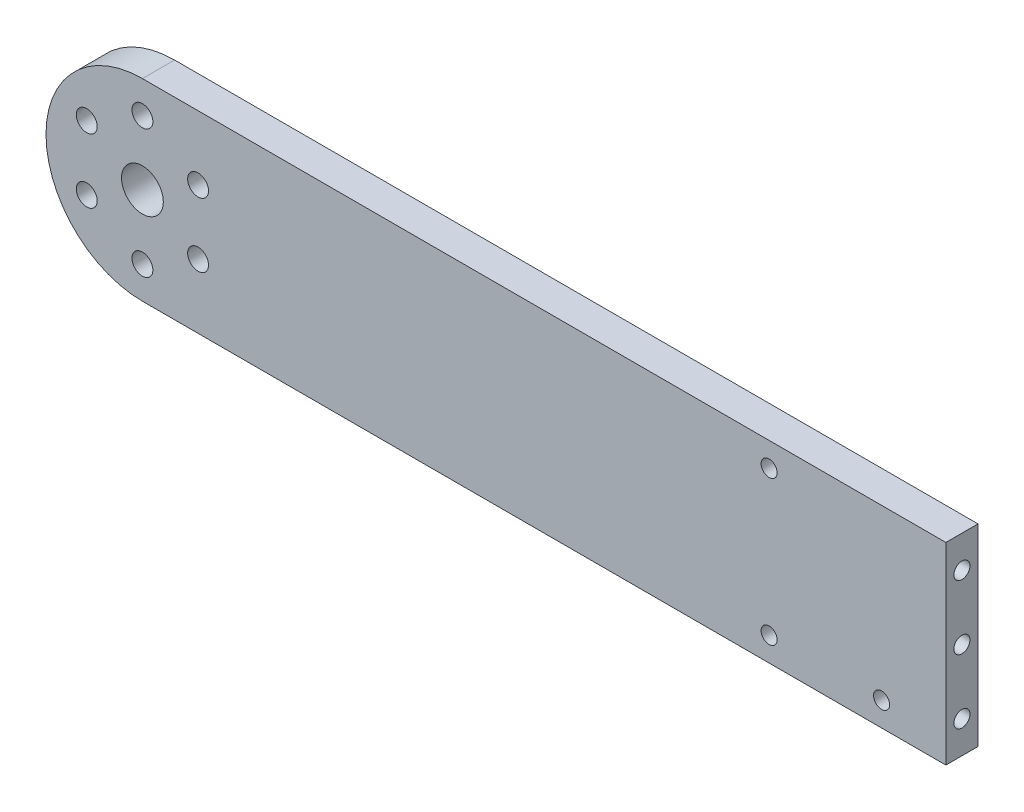
ISO-10303-21;
HEADER;
FILE_DESCRIPTION(('STEP AP214'),'2;1');
FILE_NAME('part.step','',(''),(''),'','','');
FILE_SCHEMA(('AUTOMOTIVE_DESIGN { 1 0 10303 214 1 1 1 1 }'));
ENDSEC;
DATA;
#1=APPLICATION_CONTEXT('core data for automotive mechanical design processes');
#2=APPLICATION_PROTOCOL_DEFINITION('international standard','automotive_design',2000,#1);
#3=PRODUCT_CONTEXT('',#1,'mechanical');
#4=PRODUCT('Part','Part','',(#3));
#5=PRODUCT_RELATED_PRODUCT_CATEGORY('part','',(#4));
#6=PRODUCT_DEFINITION_FORMATION('','',#4);
#7=PRODUCT_DEFINITION_CONTEXT('part definition',#1,'design');
#8=PRODUCT_DEFINITION('design','',#6,#7);
#9=PRODUCT_DEFINITION_SHAPE('','',#8);
#10=(LENGTH_UNIT() NAMED_UNIT(*) SI_UNIT(.MILLI.,.METRE.));
#11=(NAMED_UNIT(*) PLANE_ANGLE_UNIT() SI_UNIT($,.RADIAN.));
#12=(NAMED_UNIT(*) SI_UNIT($,.STERADIAN.) SOLID_ANGLE_UNIT());
#13=UNCERTAINTY_MEASURE_WITH_UNIT(LENGTH_MEASURE(1.E-05),#10,'distance_accuracy_value','');
#14=(GEOMETRIC_REPRESENTATION_CONTEXT(3) GLOBAL_UNCERTAINTY_ASSIGNED_CONTEXT((#13)) GLOBAL_UNIT_ASSIGNED_CONTEXT((#10,
#11,#12)) REPRESENTATION_CONTEXT('',''));
#15=CARTESIAN_POINT('',(0.,0.,0.));
#16=DIRECTION('',(0.,0.,1.));
#17=DIRECTION('',(1.,0.,0.));
#18=AXIS2_PLACEMENT_3D('',#15,#16,#17);
#19=CARTESIAN_POINT('',(200.,30.,10.));
#20=DIRECTION('',(0.,-1.,0.));
#21=DIRECTION('',(1.,0.,0.));
#22=AXIS2_PLACEMENT_3D('',#19,#20,#21);
#23=PLANE('',#22);
#24=DIRECTION('',(-1.,0.,0.));
#25=VECTOR('',#24,1.);
#26=CARTESIAN_POINT('',(200.,30.,0.));
#27=LINE('',#26,#25);
#28=CARTESIAN_POINT('',(250.,30.,0.));
#29=VERTEX_POINT('',#28);
#30=CARTESIAN_POINT('',(0.,30.,0.));
#31=VERTEX_POINT('',#30);
#32=EDGE_CURVE('E94',#29,#31,#27,.T.);
#33=ORIENTED_EDGE('',*,*,#32,.T.);
#34=DIRECTION('',(0.,0.,-1.));
#35=VECTOR('',#34,1.);
#36=CARTESIAN_POINT('',(0.,30.,10.));
#37=LINE('',#36,#35);
#38=CARTESIAN_POINT('',(0.,30.,10.));
#39=VERTEX_POINT('',#38);
#40=EDGE_CURVE('E11',#39,#31,#37,.T.);
#41=ORIENTED_EDGE('',*,*,#40,.F.);
#42=DIRECTION('',(-1.,0.,0.));
#43=VECTOR('',#42,1.);
#44=CARTESIAN_POINT('',(200.,30.,10.));
#45=LINE('',#44,#43);
#46=CARTESIAN_POINT('',(250.,30.,10.));
#47=VERTEX_POINT('',#46);
#48=EDGE_CURVE('E87',#47,#39,#45,.T.);
#49=ORIENTED_EDGE('',*,*,#48,.F.);
#50=DIRECTION('',(0.,0.,1.));
#51=VECTOR('',#50,1.);
#52=CARTESIAN_POINT('',(250.,30.,0.));
#53=LINE('',#52,#51);
#54=EDGE_CURVE('E98',#29,#47,#53,.T.);
#55=ORIENTED_EDGE('',*,*,#54,.F.);
#56=EDGE_LOOP('',(#33,#41,#49,#55));
#57=FACE_BOUND('',#56,.T.);
#58=ADVANCED_FACE('F39',(#57),#23,.F.);
#59=CARTESIAN_POINT('',(0.,0.,10.));
#60=DIRECTION('',(0.,0.,-1.));
#61=DIRECTION('',(-1.,0.,0.));
#62=AXIS2_PLACEMENT_3D('',#59,#60,#61);
#63=CYLINDRICAL_SURFACE('',#62,30.);
#64=CARTESIAN_POINT('',(0.,0.,0.));
#65=DIRECTION('',(0.,0.,1.));
#66=DIRECTION('',(1.,0.,0.));
#67=AXIS2_PLACEMENT_3D('',#64,#65,#66);
#68=CIRCLE('',#67,30.);
#69=CARTESIAN_POINT('',(0.,-30.,0.));
#70=VERTEX_POINT('',#69);
#71=EDGE_CURVE('E66',#31,#70,#68,.T.);
#72=ORIENTED_EDGE('',*,*,#71,.T.);
#73=DIRECTION('',(0.,0.,-1.));
#74=VECTOR('',#73,1.);
#75=CARTESIAN_POINT('',(0.,-30.,10.));
#76=LINE('',#75,#74);
#77=CARTESIAN_POINT('',(0.,-30.,10.));
#78=VERTEX_POINT('',#77);
#79=EDGE_CURVE('E47',#78,#70,#76,.T.);
#80=ORIENTED_EDGE('',*,*,#79,.F.);
#81=CARTESIAN_POINT('',(0.,0.,10.));
#82=DIRECTION('',(0.,0.,1.));
#83=DIRECTION('',(1.,0.,0.));
#84=AXIS2_PLACEMENT_3D('',#81,#82,#83);
#85=CIRCLE('',#84,30.);
#86=EDGE_CURVE('E55',#39,#78,#85,.T.);
#87=ORIENTED_EDGE('',*,*,#86,.F.);
#88=ORIENTED_EDGE('',*,*,#40,.T.);
#89=EDGE_LOOP('',(#72,#80,#87,#88));
#90=FACE_BOUND('',#89,.T.);
#91=ADVANCED_FACE('F128',(#90),#63,.T.);
#92=CARTESIAN_POINT('',(200.,-30.,10.));
#93=DIRECTION('',(0.,1.,0.));
#94=DIRECTION('',(-1.,0.,0.));
#95=AXIS2_PLACEMENT_3D('',#92,#93,#94);
#96=PLANE('',#95);
#97=DIRECTION('',(1.,0.,0.));
#98=VECTOR('',#97,1.);
#99=CARTESIAN_POINT('',(200.,-30.,0.));
#100=LINE('',#99,#98);
#101=CARTESIAN_POINT('',(250.,-30.,0.));
#102=VERTEX_POINT('',#101);
#103=EDGE_CURVE('E82',#70,#102,#100,.T.);
#104=ORIENTED_EDGE('',*,*,#103,.T.);
#105=DIRECTION('',(0.,0.,-1.));
#106=VECTOR('',#105,1.);
#107=CARTESIAN_POINT('',(250.,-30.,10.));
#108=LINE('',#107,#106);
#109=CARTESIAN_POINT('',(250.,-30.,10.));
#110=VERTEX_POINT('',#109);
#111=EDGE_CURVE('E86',#110,#102,#108,.T.);
#112=ORIENTED_EDGE('',*,*,#111,.F.);
#113=DIRECTION('',(1.,0.,0.));
#114=VECTOR('',#113,1.);
#115=CARTESIAN_POINT('',(200.,-30.,10.));
#116=LINE('',#115,#114);
#117=EDGE_CURVE('E70',#78,#110,#116,.T.);
#118=ORIENTED_EDGE('',*,*,#117,.F.);
#119=ORIENTED_EDGE('',*,*,#79,.T.);
#120=EDGE_LOOP('',(#104,#112,#118,#119));
#121=FACE_BOUND('',#120,.T.);
#122=ADVANCED_FACE('F84',(#121),#96,.F.);
#123=CARTESIAN_POINT('',(0.,0.,10.));
#124=DIRECTION('',(0.,0.,1.));
#125=DIRECTION('',(1.,0.,0.));
#126=AXIS2_PLACEMENT_3D('',#123,#124,#125);
#127=PLANE('',#126);
#128=CARTESIAN_POINT('',(-17.3205080756887,10.0000000000002,10.));
#129=DIRECTION('',(0.,0.,1.));
#130=DIRECTION('',(0.50000000000001,0.866025403784433,0.));
#131=AXIS2_PLACEMENT_3D('',#128,#129,#130);
#132=CIRCLE('',#131,3.25);
#133=CARTESIAN_POINT('',(-15.6955080756886,12.8145825622996,10.));
#134=VERTEX_POINT('',#133);
#135=EDGE_CURVE('E462',#134,#134,#132,.T.);
#136=ORIENTED_EDGE('',*,*,#135,.F.);
#137=EDGE_LOOP('',(#136));
#138=FACE_BOUND('',#137,.T.);
#139=CARTESIAN_POINT('',(-17.3205080756889,-9.99999999999984,10.));
#140=DIRECTION('',(0.,0.,1.));
#141=DIRECTION('',(-0.499999999999992,0.866025403784443,0.));
#142=AXIS2_PLACEMENT_3D('',#139,#140,#141);
#143=CIRCLE('',#142,3.25);
#144=CARTESIAN_POINT('',(-18.9455080756888,-7.1854174377004,10.));
#145=VERTEX_POINT('',#144);
#146=EDGE_CURVE('E464',#145,#145,#143,.T.);
#147=ORIENTED_EDGE('',*,*,#146,.F.);
#148=EDGE_LOOP('',(#147));
#149=FACE_BOUND('',#148,.T.);
#150=CARTESIAN_POINT('',(0.,-20.,10.));
#151=DIRECTION('',(0.,0.,1.));
#152=DIRECTION('',(-1.,0.,0.));
#153=AXIS2_PLACEMENT_3D('',#150,#151,#152);
#154=CIRCLE('',#153,3.25);
#155=CARTESIAN_POINT('',(-3.25,-20.,10.));
#156=VERTEX_POINT('',#155);
#157=EDGE_CURVE('E494',#156,#156,#154,.T.);
#158=ORIENTED_EDGE('',*,*,#157,.F.);
#159=EDGE_LOOP('',(#158));
#160=FACE_BOUND('',#159,.T.);
#161=CARTESIAN_POINT('',(17.3205080756887,-10.0000000000001,10.));
#162=DIRECTION('',(0.,0.,1.));
#163=DIRECTION('',(-0.500000000000004,-0.866025403784436,0.));
#164=AXIS2_PLACEMENT_3D('',#161,#162,#163);
#165=CIRCLE('',#164,3.25);
#166=CARTESIAN_POINT('',(15.6955080756887,-12.8145825622995,10.));
#167=VERTEX_POINT('',#166);
#168=EDGE_CURVE('E484',#167,#167,#165,.T.);
#169=ORIENTED_EDGE('',*,*,#168,.F.);
#170=EDGE_LOOP('',(#169));
#171=FACE_BOUND('',#170,.T.);
#172=CARTESIAN_POINT('',(17.3205080756888,9.99999999999996,10.));
#173=DIRECTION('',(0.,0.,1.));
#174=DIRECTION('',(0.499999999999998,-0.86602540378444,0.));
#175=AXIS2_PLACEMENT_3D('',#172,#173,#174);
#176=CIRCLE('',#175,3.25);
#177=CARTESIAN_POINT('',(18.9455080756888,7.18541743770053,10.));
#178=VERTEX_POINT('',#177);
#179=EDGE_CURVE('E471',#178,#178,#176,.T.);
#180=ORIENTED_EDGE('',*,*,#179,.F.);
#181=EDGE_LOOP('',(#180));
#182=FACE_BOUND('',#181,.T.);
#183=CARTESIAN_POINT('',(0.,20.,10.));
#184=DIRECTION('',(0.,0.,1.));
#185=DIRECTION('',(1.,0.,0.));
#186=AXIS2_PLACEMENT_3D('',#183,#184,#185);
#187=CIRCLE('',#186,3.25);
#188=CARTESIAN_POINT('',(3.25,20.,10.));
#189=VERTEX_POINT('',#188);
#190=EDGE_CURVE('E147',#189,#189,#187,.T.);
#191=ORIENTED_EDGE('',*,*,#190,.F.);
#192=EDGE_LOOP('',(#191));
#193=FACE_BOUND('',#192,.T.);
#194=CARTESIAN_POINT('',(230.,-22.5,10.));
#195=DIRECTION('',(0.,0.,1.));
#196=DIRECTION('',(1.,0.,0.));
#197=AXIS2_PLACEMENT_3D('',#194,#195,#196);
#198=CIRCLE('',#197,2.50000000000002);
#199=CARTESIAN_POINT('',(232.5,-22.5,10.));
#200=VERTEX_POINT('',#199);
#201=EDGE_CURVE('E144',#200,#200,#198,.T.);
#202=ORIENTED_EDGE('',*,*,#201,.F.);
#203=EDGE_LOOP('',(#202));
#204=FACE_BOUND('',#203,.T.);
#205=CARTESIAN_POINT('',(195.,22.5,10.));
#206=DIRECTION('',(0.,0.,1.));
#207=DIRECTION('',(1.,0.,0.));
#208=AXIS2_PLACEMENT_3D('',#205,#206,#207);
#209=CIRCLE('',#208,2.50000000000002);
#210=CARTESIAN_POINT('',(197.5,22.5,10.));
#211=VERTEX_POINT('',#210);
#212=EDGE_CURVE('E115',#211,#211,#209,.T.);
#213=ORIENTED_EDGE('',*,*,#212,.F.);
#214=EDGE_LOOP('',(#213));
#215=FACE_BOUND('',#214,.T.);
#216=CARTESIAN_POINT('',(195.,-22.5,10.));
#217=DIRECTION('',(0.,0.,1.));
#218=DIRECTION('',(1.,0.,0.));
#219=AXIS2_PLACEMENT_3D('',#216,#217,#218);
#220=CIRCLE('',#219,2.50000000000002);
#221=CARTESIAN_POINT('',(197.5,-22.5,10.));
#222=VERTEX_POINT('',#221);
#223=EDGE_CURVE('E111',#222,#222,#220,.T.);
#224=ORIENTED_EDGE('',*,*,#223,.F.);
#225=EDGE_LOOP('',(#224));
#226=FACE_BOUND('',#225,.T.);
#227=ORIENTED_EDGE('',*,*,#48,.T.);
#228=ORIENTED_EDGE('',*,*,#86,.T.);
#229=ORIENTED_EDGE('',*,*,#117,.T.);
#230=DIRECTION('',(0.,-1.,0.));
#231=VECTOR('',#230,1.);
#232=CARTESIAN_POINT('',(250.,30.,10.));
#233=LINE('',#232,#231);
#234=EDGE_CURVE('E101',#47,#110,#233,.T.);
#235=ORIENTED_EDGE('',*,*,#234,.F.);
#236=EDGE_LOOP('',(#227,#228,#229,#235));
#237=FACE_BOUND('',#236,.T.);
#238=CARTESIAN_POINT('',(0.,0.,10.));
#239=DIRECTION('',(0.,0.,1.));
#240=DIRECTION('',(1.,0.,0.));
#241=AXIS2_PLACEMENT_3D('',#238,#239,#240);
#242=CIRCLE('',#241,6.5);
#243=CARTESIAN_POINT('',(6.5,0.,10.));
#244=VERTEX_POINT('',#243);
#245=EDGE_CURVE('E138',#244,#244,#242,.T.);
#246=ORIENTED_EDGE('',*,*,#245,.F.);
#247=EDGE_LOOP('',(#246));
#248=FACE_BOUND('',#247,.T.);
#249=ADVANCED_FACE('F131',(#138,#149,#160,#171,#182,#193,#204,#215,#226,#237,#248),#127,.T.);
#250=CARTESIAN_POINT('',(0.,0.,0.));
#251=DIRECTION('',(0.,0.,1.));
#252=DIRECTION('',(1.,0.,0.));
#253=AXIS2_PLACEMENT_3D('',#250,#251,#252);
#254=PLANE('',#253);
#255=CARTESIAN_POINT('',(-17.3205080756887,10.0000000000002,0.));
#256=DIRECTION('',(0.,0.,1.));
#257=DIRECTION('',(0.50000000000001,0.866025403784433,0.));
#258=AXIS2_PLACEMENT_3D('',#255,#256,#257);
#259=CIRCLE('',#258,3.25);
#260=CARTESIAN_POINT('',(-15.6955080756886,12.8145825622996,0.));
#261=VERTEX_POINT('',#260);
#262=EDGE_CURVE('E459',#261,#261,#259,.T.);
#263=ORIENTED_EDGE('',*,*,#262,.T.);
#264=EDGE_LOOP('',(#263));
#265=FACE_BOUND('',#264,.T.);
#266=CARTESIAN_POINT('',(-17.3205080756889,-9.99999999999984,0.));
#267=DIRECTION('',(0.,0.,1.));
#268=DIRECTION('',(-0.499999999999992,0.866025403784443,0.));
#269=AXIS2_PLACEMENT_3D('',#266,#267,#268);
#270=CIRCLE('',#269,3.25);
#271=CARTESIAN_POINT('',(-18.9455080756888,-7.1854174377004,0.));
#272=VERTEX_POINT('',#271);
#273=EDGE_CURVE('E497',#272,#272,#270,.T.);
#274=ORIENTED_EDGE('',*,*,#273,.T.);
#275=EDGE_LOOP('',(#274));
#276=FACE_BOUND('',#275,.T.);
#277=CARTESIAN_POINT('',(0.,-20.,0.));
#278=DIRECTION('',(0.,0.,1.));
#279=DIRECTION('',(-1.,0.,0.));
#280=AXIS2_PLACEMENT_3D('',#277,#278,#279);
#281=CIRCLE('',#280,3.25);
#282=CARTESIAN_POINT('',(-3.25,-20.,0.));
#283=VERTEX_POINT('',#282);
#284=EDGE_CURVE('E489',#283,#283,#281,.T.);
#285=ORIENTED_EDGE('',*,*,#284,.T.);
#286=EDGE_LOOP('',(#285));
#287=FACE_BOUND('',#286,.T.);
#288=CARTESIAN_POINT('',(17.3205080756887,-10.0000000000001,0.));
#289=DIRECTION('',(0.,0.,1.));
#290=DIRECTION('',(-0.500000000000004,-0.866025403784436,0.));
#291=AXIS2_PLACEMENT_3D('',#288,#289,#290);
#292=CIRCLE('',#291,3.25);
#293=CARTESIAN_POINT('',(15.6955080756887,-12.8145825622995,0.));
#294=VERTEX_POINT('',#293);
#295=EDGE_CURVE('E473',#294,#294,#292,.T.);
#296=ORIENTED_EDGE('',*,*,#295,.T.);
#297=EDGE_LOOP('',(#296));
#298=FACE_BOUND('',#297,.T.);
#299=CARTESIAN_POINT('',(17.3205080756888,9.99999999999996,0.));
#300=DIRECTION('',(0.,0.,1.));
#301=DIRECTION('',(0.499999999999998,-0.86602540378444,0.));
#302=AXIS2_PLACEMENT_3D('',#299,#300,#301);
#303=CIRCLE('',#302,3.25);
#304=CARTESIAN_POINT('',(18.9455080756888,7.18541743770053,0.));
#305=VERTEX_POINT('',#304);
#306=EDGE_CURVE('E468',#305,#305,#303,.T.);
#307=ORIENTED_EDGE('',*,*,#306,.T.);
#308=EDGE_LOOP('',(#307));
#309=FACE_BOUND('',#308,.T.);
#310=CARTESIAN_POINT('',(0.,20.,0.));
#311=DIRECTION('',(0.,0.,1.));
#312=DIRECTION('',(1.,0.,0.));
#313=AXIS2_PLACEMENT_3D('',#310,#311,#312);
#314=CIRCLE('',#313,3.25);
#315=CARTESIAN_POINT('',(3.25,20.,0.));
#316=VERTEX_POINT('',#315);
#317=EDGE_CURVE('E141',#316,#316,#314,.T.);
#318=ORIENTED_EDGE('',*,*,#317,.T.);
#319=EDGE_LOOP('',(#318));
#320=FACE_BOUND('',#319,.T.);
#321=CARTESIAN_POINT('',(230.,-22.5,0.));
#322=DIRECTION('',(0.,0.,1.));
#323=DIRECTION('',(1.,0.,0.));
#324=AXIS2_PLACEMENT_3D('',#321,#322,#323);
#325=CIRCLE('',#324,2.50000000000002);
#326=CARTESIAN_POINT('',(232.5,-22.5,0.));
#327=VERTEX_POINT('',#326);
#328=EDGE_CURVE('E151',#327,#327,#325,.T.);
#329=ORIENTED_EDGE('',*,*,#328,.T.);
#330=EDGE_LOOP('',(#329));
#331=FACE_BOUND('',#330,.T.);
#332=CARTESIAN_POINT('',(195.,22.5,0.));
#333=DIRECTION('',(0.,0.,1.));
#334=DIRECTION('',(1.,0.,0.));
#335=AXIS2_PLACEMENT_3D('',#332,#333,#334);
#336=CIRCLE('',#335,2.50000000000002);
#337=CARTESIAN_POINT('',(197.5,22.5,0.));
#338=VERTEX_POINT('',#337);
#339=EDGE_CURVE('E112',#338,#338,#336,.T.);
#340=ORIENTED_EDGE('',*,*,#339,.T.);
#341=EDGE_LOOP('',(#340));
#342=FACE_BOUND('',#341,.T.);
#343=CARTESIAN_POINT('',(195.,-22.5,0.));
#344=DIRECTION('',(0.,0.,1.));
#345=DIRECTION('',(1.,0.,0.));
#346=AXIS2_PLACEMENT_3D('',#343,#344,#345);
#347=CIRCLE('',#346,2.50000000000002);
#348=CARTESIAN_POINT('',(197.5,-22.5,0.));
#349=VERTEX_POINT('',#348);
#350=EDGE_CURVE('E118',#349,#349,#347,.T.);
#351=ORIENTED_EDGE('',*,*,#350,.T.);
#352=EDGE_LOOP('',(#351));
#353=FACE_BOUND('',#352,.T.);
#354=ORIENTED_EDGE('',*,*,#32,.F.);
#355=DIRECTION('',(0.,1.,0.));
#356=VECTOR('',#355,1.);
#357=CARTESIAN_POINT('',(250.,-30.,0.));
#358=LINE('',#357,#356);
#359=EDGE_CURVE('E90',#102,#29,#358,.T.);
#360=ORIENTED_EDGE('',*,*,#359,.F.);
#361=ORIENTED_EDGE('',*,*,#103,.F.);
#362=ORIENTED_EDGE('',*,*,#71,.F.);
#363=EDGE_LOOP('',(#354,#360,#361,#362));
#364=FACE_BOUND('',#363,.T.);
#365=CARTESIAN_POINT('',(0.,0.,0.));
#366=DIRECTION('',(0.,0.,1.));
#367=DIRECTION('',(1.,0.,0.));
#368=AXIS2_PLACEMENT_3D('',#365,#366,#367);
#369=CIRCLE('',#368,6.5);
#370=CARTESIAN_POINT('',(6.5,0.,0.));
#371=VERTEX_POINT('',#370);
#372=EDGE_CURVE('E140',#371,#371,#369,.T.);
#373=ORIENTED_EDGE('',*,*,#372,.T.);
#374=EDGE_LOOP('',(#373));
#375=FACE_BOUND('',#374,.T.);
#376=ADVANCED_FACE('F91',(#265,#276,#287,#298,#309,#320,#331,#342,#353,#364,#375),#254,.F.);
#377=CARTESIAN_POINT('',(195.,-22.5,0.));
#378=DIRECTION('',(0.,0.,1.));
#379=DIRECTION('',(1.,0.,0.));
#380=AXIS2_PLACEMENT_3D('',#377,#378,#379);
#381=CYLINDRICAL_SURFACE('',#380,2.50000000000002);
#382=ORIENTED_EDGE('',*,*,#350,.F.);
#383=EDGE_LOOP('',(#382));
#384=FACE_BOUND('',#383,.T.);
#385=ORIENTED_EDGE('',*,*,#223,.T.);
#386=EDGE_LOOP('',(#385));
#387=FACE_BOUND('',#386,.T.);
#388=ADVANCED_FACE('F209',(#384,#387),#381,.F.);
#389=CARTESIAN_POINT('',(195.,22.5,0.));
#390=DIRECTION('',(0.,0.,1.));
#391=DIRECTION('',(1.,0.,0.));
#392=AXIS2_PLACEMENT_3D('',#389,#390,#391);
#393=CYLINDRICAL_SURFACE('',#392,2.50000000000002);
#394=ORIENTED_EDGE('',*,*,#339,.F.);
#395=EDGE_LOOP('',(#394));
#396=FACE_BOUND('',#395,.T.);
#397=ORIENTED_EDGE('',*,*,#212,.T.);
#398=EDGE_LOOP('',(#397));
#399=FACE_BOUND('',#398,.T.);
#400=ADVANCED_FACE('F181',(#396,#399),#393,.F.);
#401=CARTESIAN_POINT('',(250.,0.,0.));
#402=DIRECTION('',(1.,0.,0.));
#403=DIRECTION('',(0.,0.,-1.));
#404=AXIS2_PLACEMENT_3D('',#401,#402,#403);
#405=PLANE('',#404);
#406=CARTESIAN_POINT('',(250.,-20.,5.));
#407=DIRECTION('',(1.,0.,0.));
#408=DIRECTION('',(0.,0.,-1.));
#409=AXIS2_PLACEMENT_3D('',#406,#407,#408);
#410=CIRCLE('',#409,2.5);
#411=CARTESIAN_POINT('',(250.,-20.,2.5));
#412=VERTEX_POINT('',#411);
#413=EDGE_CURVE('E163',#412,#412,#410,.T.);
#414=ORIENTED_EDGE('',*,*,#413,.F.);
#415=EDGE_LOOP('',(#414));
#416=FACE_BOUND('',#415,.T.);
#417=CARTESIAN_POINT('',(250.,20.,5.));
#418=DIRECTION('',(1.,0.,0.));
#419=DIRECTION('',(0.,0.,-1.));
#420=AXIS2_PLACEMENT_3D('',#417,#418,#419);
#421=CIRCLE('',#420,2.5);
#422=CARTESIAN_POINT('',(250.,20.,2.5));
#423=VERTEX_POINT('',#422);
#424=EDGE_CURVE('E157',#423,#423,#421,.T.);
#425=ORIENTED_EDGE('',*,*,#424,.F.);
#426=EDGE_LOOP('',(#425));
#427=FACE_BOUND('',#426,.T.);
#428=CARTESIAN_POINT('',(250.,0.,5.));
#429=DIRECTION('',(1.,0.,0.));
#430=DIRECTION('',(0.,0.,-1.));
#431=AXIS2_PLACEMENT_3D('',#428,#429,#430);
#432=CIRCLE('',#431,2.5);
#433=CARTESIAN_POINT('',(250.,0.,2.5));
#434=VERTEX_POINT('',#433);
#435=EDGE_CURVE('E105',#434,#434,#432,.T.);
#436=ORIENTED_EDGE('',*,*,#435,.F.);
#437=EDGE_LOOP('',(#436));
#438=FACE_BOUND('',#437,.T.);
#439=ORIENTED_EDGE('',*,*,#111,.T.);
#440=ORIENTED_EDGE('',*,*,#359,.T.);
#441=ORIENTED_EDGE('',*,*,#54,.T.);
#442=ORIENTED_EDGE('',*,*,#234,.T.);
#443=EDGE_LOOP('',(#439,#440,#441,#442));
#444=FACE_BOUND('',#443,.T.);
#445=ADVANCED_FACE('F100',(#416,#427,#438,#444),#405,.T.);
#446=CARTESIAN_POINT('',(240.,0.,5.));
#447=DIRECTION('',(1.,0.,0.));
#448=DIRECTION('',(0.,0.,-1.));
#449=AXIS2_PLACEMENT_3D('',#446,#447,#448);
#450=CYLINDRICAL_SURFACE('',#449,2.5);
#451=CARTESIAN_POINT('',(240.,0.,5.));
#452=DIRECTION('',(1.,0.,0.));
#453=DIRECTION('',(0.,0.,-1.));
#454=AXIS2_PLACEMENT_3D('',#451,#452,#453);
#455=CIRCLE('',#454,2.5);
#456=CARTESIAN_POINT('',(240.,0.,2.5));
#457=VERTEX_POINT('',#456);
#458=EDGE_CURVE('E102',#457,#457,#455,.T.);
#459=ORIENTED_EDGE('',*,*,#458,.F.);
#460=EDGE_LOOP('',(#459));
#461=FACE_BOUND('',#460,.T.);
#462=ORIENTED_EDGE('',*,*,#435,.T.);
#463=EDGE_LOOP('',(#462));
#464=FACE_BOUND('',#463,.T.);
#465=ADVANCED_FACE('F180',(#461,#464),#450,.F.);
#466=CARTESIAN_POINT('',(240.,0.,5.));
#467=DIRECTION('',(1.,0.,0.));
#468=DIRECTION('',(0.,0.,-1.));
#469=AXIS2_PLACEMENT_3D('',#466,#467,#468);
#470=PLANE('',#469);
#471=ORIENTED_EDGE('',*,*,#458,.T.);
#472=EDGE_LOOP('',(#471));
#473=FACE_BOUND('',#472,.T.);
#474=ADVANCED_FACE('F189',(#473),#470,.T.);
#475=CARTESIAN_POINT('',(240.,20.,5.));
#476=DIRECTION('',(1.,0.,0.));
#477=DIRECTION('',(0.,0.,-1.));
#478=AXIS2_PLACEMENT_3D('',#475,#476,#477);
#479=CYLINDRICAL_SURFACE('',#478,2.5);
#480=CARTESIAN_POINT('',(240.,20.,5.));
#481=DIRECTION('',(1.,0.,0.));
#482=DIRECTION('',(0.,0.,-1.));
#483=AXIS2_PLACEMENT_3D('',#480,#481,#482);
#484=CIRCLE('',#483,2.5);
#485=CARTESIAN_POINT('',(240.,20.,2.5));
#486=VERTEX_POINT('',#485);
#487=EDGE_CURVE('E160',#486,#486,#484,.T.);
#488=ORIENTED_EDGE('',*,*,#487,.F.);
#489=EDGE_LOOP('',(#488));
#490=FACE_BOUND('',#489,.T.);
#491=ORIENTED_EDGE('',*,*,#424,.T.);
#492=EDGE_LOOP('',(#491));
#493=FACE_BOUND('',#492,.T.);
#494=ADVANCED_FACE('F195',(#490,#493),#479,.F.);
#495=CARTESIAN_POINT('',(240.,20.,5.));
#496=DIRECTION('',(1.,0.,0.));
#497=DIRECTION('',(0.,0.,-1.));
#498=AXIS2_PLACEMENT_3D('',#495,#496,#497);
#499=PLANE('',#498);
#500=ORIENTED_EDGE('',*,*,#487,.T.);
#501=EDGE_LOOP('',(#500));
#502=FACE_BOUND('',#501,.T.);
#503=ADVANCED_FACE('F174',(#502),#499,.T.);
#504=CARTESIAN_POINT('',(240.,-20.,5.));
#505=DIRECTION('',(1.,0.,0.));
#506=DIRECTION('',(0.,0.,-1.));
#507=AXIS2_PLACEMENT_3D('',#504,#505,#506);
#508=CYLINDRICAL_SURFACE('',#507,2.5);
#509=CARTESIAN_POINT('',(240.,-20.,5.));
#510=DIRECTION('',(1.,0.,0.));
#511=DIRECTION('',(0.,0.,-1.));
#512=AXIS2_PLACEMENT_3D('',#509,#510,#511);
#513=CIRCLE('',#512,2.5);
#514=CARTESIAN_POINT('',(240.,-20.,2.5));
#515=VERTEX_POINT('',#514);
#516=EDGE_CURVE('E154',#515,#515,#513,.T.);
#517=ORIENTED_EDGE('',*,*,#516,.F.);
#518=EDGE_LOOP('',(#517));
#519=FACE_BOUND('',#518,.T.);
#520=ORIENTED_EDGE('',*,*,#413,.T.);
#521=EDGE_LOOP('',(#520));
#522=FACE_BOUND('',#521,.T.);
#523=ADVANCED_FACE('F171',(#519,#522),#508,.F.);
#524=CARTESIAN_POINT('',(240.,-20.,5.));
#525=DIRECTION('',(1.,0.,0.));
#526=DIRECTION('',(0.,0.,-1.));
#527=AXIS2_PLACEMENT_3D('',#524,#525,#526);
#528=PLANE('',#527);
#529=ORIENTED_EDGE('',*,*,#516,.T.);
#530=EDGE_LOOP('',(#529));
#531=FACE_BOUND('',#530,.T.);
#532=ADVANCED_FACE('F169',(#531),#528,.T.);
#533=CARTESIAN_POINT('',(230.,-22.5,0.));
#534=DIRECTION('',(0.,0.,1.));
#535=DIRECTION('',(1.,0.,0.));
#536=AXIS2_PLACEMENT_3D('',#533,#534,#535);
#537=CYLINDRICAL_SURFACE('',#536,2.50000000000002);
#538=ORIENTED_EDGE('',*,*,#328,.F.);
#539=EDGE_LOOP('',(#538));
#540=FACE_BOUND('',#539,.T.);
#541=ORIENTED_EDGE('',*,*,#201,.T.);
#542=EDGE_LOOP('',(#541));
#543=FACE_BOUND('',#542,.T.);
#544=ADVANCED_FACE('F288',(#540,#543),#537,.F.);
#545=CARTESIAN_POINT('',(0.,0.,0.));
#546=DIRECTION('',(0.,0.,1.));
#547=DIRECTION('',(1.,0.,0.));
#548=AXIS2_PLACEMENT_3D('',#545,#546,#547);
#549=CYLINDRICAL_SURFACE('',#548,6.5);
#550=ORIENTED_EDGE('',*,*,#372,.F.);
#551=EDGE_LOOP('',(#550));
#552=FACE_BOUND('',#551,.T.);
#553=ORIENTED_EDGE('',*,*,#245,.T.);
#554=EDGE_LOOP('',(#553));
#555=FACE_BOUND('',#554,.T.);
#556=ADVANCED_FACE('F298',(#552,#555),#549,.F.);
#557=CARTESIAN_POINT('',(0.,20.,0.));
#558=DIRECTION('',(0.,0.,1.));
#559=DIRECTION('',(1.,0.,0.));
#560=AXIS2_PLACEMENT_3D('',#557,#558,#559);
#561=CYLINDRICAL_SURFACE('',#560,3.25);
#562=ORIENTED_EDGE('',*,*,#317,.F.);
#563=EDGE_LOOP('',(#562));
#564=FACE_BOUND('',#563,.T.);
#565=ORIENTED_EDGE('',*,*,#190,.T.);
#566=EDGE_LOOP('',(#565));
#567=FACE_BOUND('',#566,.T.);
#568=ADVANCED_FACE('F310',(#564,#567),#561,.F.);
#569=CARTESIAN_POINT('',(17.3205080756888,9.99999999999996,0.));
#570=DIRECTION('',(0.,0.,1.));
#571=DIRECTION('',(1.,0.,0.));
#572=AXIS2_PLACEMENT_3D('',#569,#570,#571);
#573=CYLINDRICAL_SURFACE('',#572,3.25);
#574=ORIENTED_EDGE('',*,*,#306,.F.);
#575=EDGE_LOOP('',(#574));
#576=FACE_BOUND('',#575,.T.);
#577=ORIENTED_EDGE('',*,*,#179,.T.);
#578=EDGE_LOOP('',(#577));
#579=FACE_BOUND('',#578,.T.);
#580=ADVANCED_FACE('F322',(#576,#579),#573,.F.);
#581=CARTESIAN_POINT('',(17.3205080756887,-10.0000000000001,0.));
#582=DIRECTION('',(0.,0.,1.));
#583=DIRECTION('',(1.,0.,0.));
#584=AXIS2_PLACEMENT_3D('',#581,#582,#583);
#585=CYLINDRICAL_SURFACE('',#584,3.25);
#586=ORIENTED_EDGE('',*,*,#295,.F.);
#587=EDGE_LOOP('',(#586));
#588=FACE_BOUND('',#587,.T.);
#589=ORIENTED_EDGE('',*,*,#168,.T.);
#590=EDGE_LOOP('',(#589));
#591=FACE_BOUND('',#590,.T.);
#592=ADVANCED_FACE('F344',(#588,#591),#585,.F.);
#593=CARTESIAN_POINT('',(0.,-20.,0.));
#594=DIRECTION('',(0.,0.,1.));
#595=DIRECTION('',(1.,0.,0.));
#596=AXIS2_PLACEMENT_3D('',#593,#594,#595);
#597=CYLINDRICAL_SURFACE('',#596,3.25);
#598=ORIENTED_EDGE('',*,*,#284,.F.);
#599=EDGE_LOOP('',(#598));
#600=FACE_BOUND('',#599,.T.);
#601=ORIENTED_EDGE('',*,*,#157,.T.);
#602=EDGE_LOOP('',(#601));
#603=FACE_BOUND('',#602,.T.);
#604=ADVANCED_FACE('F355',(#600,#603),#597,.F.);
#605=CARTESIAN_POINT('',(-17.3205080756889,-9.99999999999984,0.));
#606=DIRECTION('',(0.,0.,1.));
#607=DIRECTION('',(1.,0.,0.));
#608=AXIS2_PLACEMENT_3D('',#605,#606,#607);
#609=CYLINDRICAL_SURFACE('',#608,3.25);
#610=ORIENTED_EDGE('',*,*,#273,.F.);
#611=EDGE_LOOP('',(#610));
#612=FACE_BOUND('',#611,.T.);
#613=ORIENTED_EDGE('',*,*,#146,.T.);
#614=EDGE_LOOP('',(#613));
#615=FACE_BOUND('',#614,.T.);
#616=ADVANCED_FACE('F366',(#612,#615),#609,.F.);
#617=CARTESIAN_POINT('',(-17.3205080756887,10.0000000000002,0.));
#618=DIRECTION('',(0.,0.,1.));
#619=DIRECTION('',(1.,0.,0.));
#620=AXIS2_PLACEMENT_3D('',#617,#618,#619);
#621=CYLINDRICAL_SURFACE('',#620,3.25);
#622=ORIENTED_EDGE('',*,*,#262,.F.);
#623=EDGE_LOOP('',(#622));
#624=FACE_BOUND('',#623,.T.);
#625=ORIENTED_EDGE('',*,*,#135,.T.);
#626=EDGE_LOOP('',(#625));
#627=FACE_BOUND('',#626,.T.);
#628=ADVANCED_FACE('F377',(#624,#627),#621,.F.);
#629=CLOSED_SHELL('',(#58,#91,#122,#249,#376,#388,#400,#445,#465,#474,#494,#503,#523,#532,#544,
#556,#568,#580,#592,#604,#616,#628));
#630=MANIFOLD_SOLID_BREP('B2',#629);
#631=ADVANCED_BREP_SHAPE_REPRESENTATION('',(#18,#630),#14);
#632=SHAPE_DEFINITION_REPRESENTATION(#9,#631);
ENDSEC;
END-ISO-10303-21;
